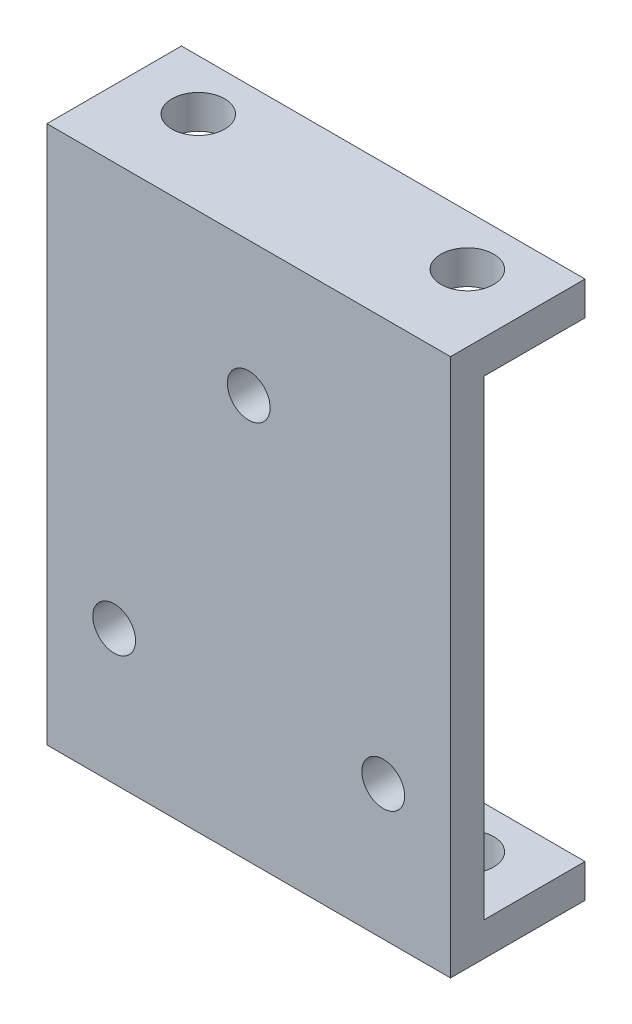
ISO-10303-21;
HEADER;
FILE_DESCRIPTION(('STEP AP214'),'2;1');
FILE_NAME('part.step','',(''),(''),'','','');
FILE_SCHEMA(('AUTOMOTIVE_DESIGN { 1 0 10303 214 1 1 1 1 }'));
ENDSEC;
DATA;
#1=APPLICATION_CONTEXT('core data for automotive mechanical design processes');
#2=APPLICATION_PROTOCOL_DEFINITION('international standard','automotive_design',2000,#1);
#3=PRODUCT_CONTEXT('',#1,'mechanical');
#4=PRODUCT('Part','Part','',(#3));
#5=PRODUCT_RELATED_PRODUCT_CATEGORY('part','',(#4));
#6=PRODUCT_DEFINITION_FORMATION('','',#4);
#7=PRODUCT_DEFINITION_CONTEXT('part definition',#1,'design');
#8=PRODUCT_DEFINITION('design','',#6,#7);
#9=PRODUCT_DEFINITION_SHAPE('','',#8);
#10=(LENGTH_UNIT() NAMED_UNIT(*) SI_UNIT(.MILLI.,.METRE.));
#11=(NAMED_UNIT(*) PLANE_ANGLE_UNIT() SI_UNIT($,.RADIAN.));
#12=(NAMED_UNIT(*) SI_UNIT($,.STERADIAN.) SOLID_ANGLE_UNIT());
#13=UNCERTAINTY_MEASURE_WITH_UNIT(LENGTH_MEASURE(1.E-05),#10,'distance_accuracy_value','');
#14=(GEOMETRIC_REPRESENTATION_CONTEXT(3) GLOBAL_UNCERTAINTY_ASSIGNED_CONTEXT((#13)) GLOBAL_UNIT_ASSIGNED_CONTEXT((#10,
#11,#12)) REPRESENTATION_CONTEXT('',''));
#15=CARTESIAN_POINT('',(0.,0.,0.));
#16=DIRECTION('',(0.,0.,1.));
#17=DIRECTION('',(1.,0.,0.));
#18=AXIS2_PLACEMENT_3D('',#15,#16,#17);
#19=CARTESIAN_POINT('',(-12.7,-25.4,-7.9375));
#20=DIRECTION('',(0.,1.,0.));
#21=DIRECTION('',(0.,0.,1.));
#22=AXIS2_PLACEMENT_3D('',#19,#20,#21);
#23=CYLINDRICAL_SURFACE('',#22,2.4892);
#24=CARTESIAN_POINT('',(-12.7,22.225,-7.9375));
#25=DIRECTION('',(0.,1.,0.));
#26=DIRECTION('',(0.,0.,1.));
#27=AXIS2_PLACEMENT_3D('',#24,#25,#26);
#28=CIRCLE('',#27,2.4892);
#29=CARTESIAN_POINT('',(-12.7,22.225,-5.4483));
#30=VERTEX_POINT('',#29);
#31=EDGE_CURVE('E20',#30,#30,#28,.F.);
#32=ORIENTED_EDGE('',*,*,#31,.T.);
#33=EDGE_LOOP('',(#32));
#34=FACE_BOUND('',#33,.T.);
#35=CARTESIAN_POINT('',(-12.7,25.4,-7.9375));
#36=DIRECTION('',(0.,1.,0.));
#37=DIRECTION('',(0.,0.,1.));
#38=AXIS2_PLACEMENT_3D('',#35,#36,#37);
#39=CIRCLE('',#38,2.4892);
#40=CARTESIAN_POINT('',(-12.7,25.4,-5.4483));
#41=VERTEX_POINT('',#40);
#42=EDGE_CURVE('E147',#41,#41,#39,.T.);
#43=ORIENTED_EDGE('',*,*,#42,.T.);
#44=EDGE_LOOP('',(#43));
#45=FACE_BOUND('',#44,.T.);
#46=ADVANCED_FACE('F17',(#34,#45),#23,.F.);
#47=CARTESIAN_POINT('',(12.7,-25.4,-7.9375));
#48=DIRECTION('',(0.,1.,0.));
#49=DIRECTION('',(0.,0.,1.));
#50=AXIS2_PLACEMENT_3D('',#47,#48,#49);
#51=CYLINDRICAL_SURFACE('',#50,2.4892);
#52=CARTESIAN_POINT('',(12.7,22.225,-7.9375));
#53=DIRECTION('',(0.,1.,0.));
#54=DIRECTION('',(0.,0.,1.));
#55=AXIS2_PLACEMENT_3D('',#52,#53,#54);
#56=CIRCLE('',#55,2.4892);
#57=CARTESIAN_POINT('',(12.7,22.225,-5.4483));
#58=VERTEX_POINT('',#57);
#59=EDGE_CURVE('E126',#58,#58,#56,.F.);
#60=ORIENTED_EDGE('',*,*,#59,.T.);
#61=EDGE_LOOP('',(#60));
#62=FACE_BOUND('',#61,.T.);
#63=CARTESIAN_POINT('',(12.7,25.4,-7.9375));
#64=DIRECTION('',(0.,1.,0.));
#65=DIRECTION('',(0.,0.,1.));
#66=AXIS2_PLACEMENT_3D('',#63,#64,#65);
#67=CIRCLE('',#66,2.4892);
#68=CARTESIAN_POINT('',(12.7,25.4,-5.4483));
#69=VERTEX_POINT('',#68);
#70=EDGE_CURVE('E96',#69,#69,#67,.T.);
#71=ORIENTED_EDGE('',*,*,#70,.T.);
#72=EDGE_LOOP('',(#71));
#73=FACE_BOUND('',#72,.T.);
#74=ADVANCED_FACE('F234',(#62,#73),#51,.F.);
#75=CARTESIAN_POINT('',(-12.7,-25.4,-7.9375));
#76=DIRECTION('',(0.,1.,0.));
#77=DIRECTION('',(0.,0.,1.));
#78=AXIS2_PLACEMENT_3D('',#75,#76,#77);
#79=CYLINDRICAL_SURFACE('',#78,2.4892);
#80=CARTESIAN_POINT('',(-12.7,-25.4,-7.9375));
#81=DIRECTION('',(0.,1.,0.));
#82=DIRECTION('',(0.,0.,1.));
#83=AXIS2_PLACEMENT_3D('',#80,#81,#82);
#84=CIRCLE('',#83,2.4892);
#85=CARTESIAN_POINT('',(-12.7,-25.4,-5.4483));
#86=VERTEX_POINT('',#85);
#87=EDGE_CURVE('E141',#86,#86,#84,.F.);
#88=ORIENTED_EDGE('',*,*,#87,.T.);
#89=EDGE_LOOP('',(#88));
#90=FACE_BOUND('',#89,.T.);
#91=CARTESIAN_POINT('',(-12.7,-22.225,-7.9375));
#92=DIRECTION('',(0.,1.,0.));
#93=DIRECTION('',(0.,0.,1.));
#94=AXIS2_PLACEMENT_3D('',#91,#92,#93);
#95=CIRCLE('',#94,2.4892);
#96=CARTESIAN_POINT('',(-12.7,-22.225,-5.4483));
#97=VERTEX_POINT('',#96);
#98=EDGE_CURVE('E124',#97,#97,#95,.T.);
#99=ORIENTED_EDGE('',*,*,#98,.T.);
#100=EDGE_LOOP('',(#99));
#101=FACE_BOUND('',#100,.T.);
#102=ADVANCED_FACE('F232',(#90,#101),#79,.F.);
#103=CARTESIAN_POINT('',(12.7,-25.4,-7.9375));
#104=DIRECTION('',(0.,1.,0.));
#105=DIRECTION('',(0.,0.,1.));
#106=AXIS2_PLACEMENT_3D('',#103,#104,#105);
#107=CYLINDRICAL_SURFACE('',#106,2.4892);
#108=CARTESIAN_POINT('',(12.7,-25.4,-7.9375));
#109=DIRECTION('',(0.,1.,0.));
#110=DIRECTION('',(0.,0.,1.));
#111=AXIS2_PLACEMENT_3D('',#108,#109,#110);
#112=CIRCLE('',#111,2.4892);
#113=CARTESIAN_POINT('',(12.7,-25.4,-5.4483));
#114=VERTEX_POINT('',#113);
#115=EDGE_CURVE('E137',#114,#114,#112,.F.);
#116=ORIENTED_EDGE('',*,*,#115,.T.);
#117=EDGE_LOOP('',(#116));
#118=FACE_BOUND('',#117,.T.);
#119=CARTESIAN_POINT('',(12.7,-22.225,-7.9375));
#120=DIRECTION('',(0.,1.,0.));
#121=DIRECTION('',(0.,0.,1.));
#122=AXIS2_PLACEMENT_3D('',#119,#120,#121);
#123=CIRCLE('',#122,2.4892);
#124=CARTESIAN_POINT('',(12.7,-22.225,-5.4483));
#125=VERTEX_POINT('',#124);
#126=EDGE_CURVE('E120',#125,#125,#123,.T.);
#127=ORIENTED_EDGE('',*,*,#126,.T.);
#128=EDGE_LOOP('',(#127));
#129=FACE_BOUND('',#128,.T.);
#130=ADVANCED_FACE('F181',(#118,#129),#107,.F.);
#131=CARTESIAN_POINT('',(19.05,25.4,-12.7));
#132=DIRECTION('',(0.,0.,1.));
#133=DIRECTION('',(1.,0.,0.));
#134=AXIS2_PLACEMENT_3D('',#131,#132,#133);
#135=PLANE('',#134);
#136=DIRECTION('',(1.,0.,0.));
#137=VECTOR('',#136,1.);
#138=CARTESIAN_POINT('',(19.05,25.4,-12.7));
#139=LINE('',#138,#137);
#140=CARTESIAN_POINT('',(-19.05,25.4,-12.7));
#141=VERTEX_POINT('',#140);
#142=CARTESIAN_POINT('',(19.05,25.4,-12.7));
#143=VERTEX_POINT('',#142);
#144=EDGE_CURVE('E86',#141,#143,#139,.T.);
#145=ORIENTED_EDGE('',*,*,#144,.T.);
#146=DIRECTION('',(0.,1.,0.));
#147=VECTOR('',#146,1.);
#148=CARTESIAN_POINT('',(19.05,-25.4,-12.7));
#149=LINE('',#148,#147);
#150=CARTESIAN_POINT('',(19.05,22.225,-12.7));
#151=VERTEX_POINT('',#150);
#152=EDGE_CURVE('E89',#143,#151,#149,.F.);
#153=ORIENTED_EDGE('',*,*,#152,.T.);
#154=DIRECTION('',(1.,0.,0.));
#155=VECTOR('',#154,1.);
#156=CARTESIAN_POINT('',(19.05,22.225,-12.7));
#157=LINE('',#156,#155);
#158=CARTESIAN_POINT('',(-19.05,22.225,-12.7));
#159=VERTEX_POINT('',#158);
#160=EDGE_CURVE('E80',#151,#159,#157,.F.);
#161=ORIENTED_EDGE('',*,*,#160,.T.);
#162=DIRECTION('',(0.,1.,0.));
#163=VECTOR('',#162,1.);
#164=CARTESIAN_POINT('',(-19.05,-25.4,-12.7));
#165=LINE('',#164,#163);
#166=EDGE_CURVE('E90',#141,#159,#165,.F.);
#167=ORIENTED_EDGE('',*,*,#166,.F.);
#168=EDGE_LOOP('',(#145,#153,#161,#167));
#169=FACE_BOUND('',#168,.T.);
#170=ADVANCED_FACE('F88',(#169),#135,.F.);
#171=CARTESIAN_POINT('',(19.05,22.225,-12.7));
#172=DIRECTION('',(0.,1.,0.));
#173=DIRECTION('',(0.,0.,1.));
#174=AXIS2_PLACEMENT_3D('',#171,#172,#173);
#175=PLANE('',#174);
#176=ORIENTED_EDGE('',*,*,#160,.F.);
#177=DIRECTION('',(0.,0.,1.));
#178=VECTOR('',#177,1.);
#179=CARTESIAN_POINT('',(19.05,22.225,0.));
#180=LINE('',#179,#178);
#181=CARTESIAN_POINT('',(19.05,22.225,-3.175));
#182=VERTEX_POINT('',#181);
#183=EDGE_CURVE('E104',#151,#182,#180,.T.);
#184=ORIENTED_EDGE('',*,*,#183,.T.);
#185=DIRECTION('',(1.,0.,0.));
#186=VECTOR('',#185,1.);
#187=CARTESIAN_POINT('',(19.05,22.225,-3.175));
#188=LINE('',#187,#186);
#189=CARTESIAN_POINT('',(-19.05,22.225,-3.175));
#190=VERTEX_POINT('',#189);
#191=EDGE_CURVE('E121',#182,#190,#188,.F.);
#192=ORIENTED_EDGE('',*,*,#191,.T.);
#193=DIRECTION('',(0.,0.,1.));
#194=VECTOR('',#193,1.);
#195=CARTESIAN_POINT('',(-19.05,22.225,0.));
#196=LINE('',#195,#194);
#197=EDGE_CURVE('E377',#159,#190,#196,.T.);
#198=ORIENTED_EDGE('',*,*,#197,.F.);
#199=EDGE_LOOP('',(#176,#184,#192,#198));
#200=FACE_BOUND('',#199,.T.);
#201=ORIENTED_EDGE('',*,*,#59,.F.);
#202=EDGE_LOOP('',(#201));
#203=FACE_BOUND('',#202,.T.);
#204=ORIENTED_EDGE('',*,*,#31,.F.);
#205=EDGE_LOOP('',(#204));
#206=FACE_BOUND('',#205,.T.);
#207=ADVANCED_FACE('F169',(#200,#203,#206),#175,.F.);
#208=CARTESIAN_POINT('',(19.05,22.225,-3.175));
#209=DIRECTION('',(0.,0.,1.));
#210=DIRECTION('',(1.,0.,0.));
#211=AXIS2_PLACEMENT_3D('',#208,#209,#210);
#212=PLANE('',#211);
#213=ORIENTED_EDGE('',*,*,#191,.F.);
#214=DIRECTION('',(0.,1.,0.));
#215=VECTOR('',#214,1.);
#216=CARTESIAN_POINT('',(19.05,-25.4,-3.175));
#217=LINE('',#216,#215);
#218=CARTESIAN_POINT('',(19.05,-22.225,-3.175));
#219=VERTEX_POINT('',#218);
#220=EDGE_CURVE('E363',#182,#219,#217,.F.);
#221=ORIENTED_EDGE('',*,*,#220,.T.);
#222=DIRECTION('',(1.,0.,0.));
#223=VECTOR('',#222,1.);
#224=CARTESIAN_POINT('',(19.05,-22.225,-3.175));
#225=LINE('',#224,#223);
#226=CARTESIAN_POINT('',(-19.05,-22.225,-3.175));
#227=VERTEX_POINT('',#226);
#228=EDGE_CURVE('E117',#219,#227,#225,.F.);
#229=ORIENTED_EDGE('',*,*,#228,.T.);
#230=DIRECTION('',(0.,1.,0.));
#231=VECTOR('',#230,1.);
#232=CARTESIAN_POINT('',(-19.05,-25.4,-3.175));
#233=LINE('',#232,#231);
#234=EDGE_CURVE('E379',#190,#227,#233,.F.);
#235=ORIENTED_EDGE('',*,*,#234,.F.);
#236=EDGE_LOOP('',(#213,#221,#229,#235));
#237=FACE_BOUND('',#236,.T.);
#238=CARTESIAN_POINT('',(12.7,-12.7,-3.175));
#239=DIRECTION('',(0.,0.,1.));
#240=DIRECTION('',(1.,0.,0.));
#241=AXIS2_PLACEMENT_3D('',#238,#239,#240);
#242=CIRCLE('',#241,2.0193);
#243=CARTESIAN_POINT('',(14.7193,-12.7,-3.175));
#244=VERTEX_POINT('',#243);
#245=EDGE_CURVE('E150',#244,#244,#242,.T.);
#246=ORIENTED_EDGE('',*,*,#245,.T.);
#247=EDGE_LOOP('',(#246));
#248=FACE_BOUND('',#247,.T.);
#249=CARTESIAN_POINT('',(-12.7,-12.7,-3.175));
#250=DIRECTION('',(0.,0.,1.));
#251=DIRECTION('',(1.,0.,0.));
#252=AXIS2_PLACEMENT_3D('',#249,#250,#251);
#253=CIRCLE('',#252,2.0193);
#254=CARTESIAN_POINT('',(-10.6807,-12.7,-3.175));
#255=VERTEX_POINT('',#254);
#256=EDGE_CURVE('E153',#255,#255,#253,.T.);
#257=ORIENTED_EDGE('',*,*,#256,.T.);
#258=EDGE_LOOP('',(#257));
#259=FACE_BOUND('',#258,.T.);
#260=CARTESIAN_POINT('',(0.,12.7,-3.175));
#261=DIRECTION('',(0.,0.,1.));
#262=DIRECTION('',(1.,0.,0.));
#263=AXIS2_PLACEMENT_3D('',#260,#261,#262);
#264=CIRCLE('',#263,2.0193);
#265=CARTESIAN_POINT('',(2.0193,12.7,-3.175));
#266=VERTEX_POINT('',#265);
#267=EDGE_CURVE('E116',#266,#266,#264,.T.);
#268=ORIENTED_EDGE('',*,*,#267,.T.);
#269=EDGE_LOOP('',(#268));
#270=FACE_BOUND('',#269,.T.);
#271=ADVANCED_FACE('F171',(#237,#248,#259,#270),#212,.F.);
#272=CARTESIAN_POINT('',(19.05,-22.225,-3.175));
#273=DIRECTION('',(0.,-1.,0.));
#274=DIRECTION('',(0.,0.,-1.));
#275=AXIS2_PLACEMENT_3D('',#272,#273,#274);
#276=PLANE('',#275);
#277=ORIENTED_EDGE('',*,*,#228,.F.);
#278=DIRECTION('',(0.,0.,1.));
#279=VECTOR('',#278,1.);
#280=CARTESIAN_POINT('',(19.05,-22.225,0.));
#281=LINE('',#280,#279);
#282=CARTESIAN_POINT('',(19.05,-22.225,-12.7));
#283=VERTEX_POINT('',#282);
#284=EDGE_CURVE('E359',#219,#283,#281,.F.);
#285=ORIENTED_EDGE('',*,*,#284,.T.);
#286=DIRECTION('',(1.,0.,0.));
#287=VECTOR('',#286,1.);
#288=CARTESIAN_POINT('',(19.05,-22.225,-12.7));
#289=LINE('',#288,#287);
#290=CARTESIAN_POINT('',(-19.05,-22.225,-12.7));
#291=VERTEX_POINT('',#290);
#292=EDGE_CURVE('E113',#283,#291,#289,.F.);
#293=ORIENTED_EDGE('',*,*,#292,.T.);
#294=DIRECTION('',(0.,0.,1.));
#295=VECTOR('',#294,1.);
#296=CARTESIAN_POINT('',(-19.05,-22.225,0.));
#297=LINE('',#296,#295);
#298=EDGE_CURVE('E360',#227,#291,#297,.F.);
#299=ORIENTED_EDGE('',*,*,#298,.F.);
#300=EDGE_LOOP('',(#277,#285,#293,#299));
#301=FACE_BOUND('',#300,.T.);
#302=ORIENTED_EDGE('',*,*,#126,.F.);
#303=EDGE_LOOP('',(#302));
#304=FACE_BOUND('',#303,.T.);
#305=ORIENTED_EDGE('',*,*,#98,.F.);
#306=EDGE_LOOP('',(#305));
#307=FACE_BOUND('',#306,.T.);
#308=ADVANCED_FACE('F178',(#301,#304,#307),#276,.F.);
#309=CARTESIAN_POINT('',(19.05,-22.225,-12.7));
#310=DIRECTION('',(0.,0.,1.));
#311=DIRECTION('',(1.,0.,0.));
#312=AXIS2_PLACEMENT_3D('',#309,#310,#311);
#313=PLANE('',#312);
#314=ORIENTED_EDGE('',*,*,#292,.F.);
#315=DIRECTION('',(0.,1.,0.));
#316=VECTOR('',#315,1.);
#317=CARTESIAN_POINT('',(19.05,-25.4,-12.7));
#318=LINE('',#317,#316);
#319=CARTESIAN_POINT('',(19.05,-25.4,-12.7));
#320=VERTEX_POINT('',#319);
#321=EDGE_CURVE('E144',#283,#320,#318,.F.);
#322=ORIENTED_EDGE('',*,*,#321,.T.);
#323=DIRECTION('',(1.,0.,0.));
#324=VECTOR('',#323,1.);
#325=CARTESIAN_POINT('',(19.05,-25.4,-12.7));
#326=LINE('',#325,#324);
#327=CARTESIAN_POINT('',(-19.05,-25.4,-12.7));
#328=VERTEX_POINT('',#327);
#329=EDGE_CURVE('E371',#320,#328,#326,.F.);
#330=ORIENTED_EDGE('',*,*,#329,.T.);
#331=DIRECTION('',(0.,1.,0.));
#332=VECTOR('',#331,1.);
#333=CARTESIAN_POINT('',(-19.05,-25.4,-12.7));
#334=LINE('',#333,#332);
#335=EDGE_CURVE('E136',#291,#328,#334,.F.);
#336=ORIENTED_EDGE('',*,*,#335,.F.);
#337=EDGE_LOOP('',(#314,#322,#330,#336));
#338=FACE_BOUND('',#337,.T.);
#339=ADVANCED_FACE('F215',(#338),#313,.F.);
#340=CARTESIAN_POINT('',(0.,12.7,-12.7));
#341=DIRECTION('',(0.,0.,1.));
#342=DIRECTION('',(1.,0.,0.));
#343=AXIS2_PLACEMENT_3D('',#340,#341,#342);
#344=CYLINDRICAL_SURFACE('',#343,2.0193);
#345=ORIENTED_EDGE('',*,*,#267,.F.);
#346=EDGE_LOOP('',(#345));
#347=FACE_BOUND('',#346,.T.);
#348=CARTESIAN_POINT('',(0.,12.7,0.));
#349=DIRECTION('',(0.,0.,1.));
#350=DIRECTION('',(1.,0.,0.));
#351=AXIS2_PLACEMENT_3D('',#348,#349,#350);
#352=CIRCLE('',#351,2.0193);
#353=CARTESIAN_POINT('',(2.0193,12.7,0.));
#354=VERTEX_POINT('',#353);
#355=EDGE_CURVE('E133',#354,#354,#352,.T.);
#356=ORIENTED_EDGE('',*,*,#355,.T.);
#357=EDGE_LOOP('',(#356));
#358=FACE_BOUND('',#357,.T.);
#359=ADVANCED_FACE('F211',(#347,#358),#344,.F.);
#360=CARTESIAN_POINT('',(-12.7,-12.7,-12.7));
#361=DIRECTION('',(0.,0.,1.));
#362=DIRECTION('',(1.,0.,0.));
#363=AXIS2_PLACEMENT_3D('',#360,#361,#362);
#364=CYLINDRICAL_SURFACE('',#363,2.0193);
#365=ORIENTED_EDGE('',*,*,#256,.F.);
#366=EDGE_LOOP('',(#365));
#367=FACE_BOUND('',#366,.T.);
#368=CARTESIAN_POINT('',(-12.7,-12.7,0.));
#369=DIRECTION('',(0.,0.,1.));
#370=DIRECTION('',(1.,0.,0.));
#371=AXIS2_PLACEMENT_3D('',#368,#369,#370);
#372=CIRCLE('',#371,2.0193);
#373=CARTESIAN_POINT('',(-10.6807,-12.7,0.));
#374=VERTEX_POINT('',#373);
#375=EDGE_CURVE('E130',#374,#374,#372,.T.);
#376=ORIENTED_EDGE('',*,*,#375,.T.);
#377=EDGE_LOOP('',(#376));
#378=FACE_BOUND('',#377,.T.);
#379=ADVANCED_FACE('F207',(#367,#378),#364,.F.);
#380=CARTESIAN_POINT('',(12.7,-12.7,-12.7));
#381=DIRECTION('',(0.,0.,1.));
#382=DIRECTION('',(1.,0.,0.));
#383=AXIS2_PLACEMENT_3D('',#380,#381,#382);
#384=CYLINDRICAL_SURFACE('',#383,2.0193);
#385=ORIENTED_EDGE('',*,*,#245,.F.);
#386=EDGE_LOOP('',(#385));
#387=FACE_BOUND('',#386,.T.);
#388=CARTESIAN_POINT('',(12.7,-12.7,0.));
#389=DIRECTION('',(0.,0.,1.));
#390=DIRECTION('',(1.,0.,0.));
#391=AXIS2_PLACEMENT_3D('',#388,#389,#390);
#392=CIRCLE('',#391,2.0193);
#393=CARTESIAN_POINT('',(14.7193,-12.7,0.));
#394=VERTEX_POINT('',#393);
#395=EDGE_CURVE('E127',#394,#394,#392,.T.);
#396=ORIENTED_EDGE('',*,*,#395,.T.);
#397=EDGE_LOOP('',(#396));
#398=FACE_BOUND('',#397,.T.);
#399=ADVANCED_FACE('F204',(#387,#398),#384,.F.);
#400=CARTESIAN_POINT('',(19.05,25.4,0.));
#401=DIRECTION('',(0.,-1.,0.));
#402=DIRECTION('',(0.,0.,-1.));
#403=AXIS2_PLACEMENT_3D('',#400,#401,#402);
#404=PLANE('',#403);
#405=DIRECTION('',(-1.,0.,0.));
#406=VECTOR('',#405,1.);
#407=CARTESIAN_POINT('',(19.05,25.4,0.));
#408=LINE('',#407,#406);
#409=CARTESIAN_POINT('',(-19.05,25.4,0.));
#410=VERTEX_POINT('',#409);
#411=CARTESIAN_POINT('',(19.05,25.4,0.));
#412=VERTEX_POINT('',#411);
#413=EDGE_CURVE('E109',#410,#412,#408,.F.);
#414=ORIENTED_EDGE('',*,*,#413,.T.);
#415=DIRECTION('',(0.,0.,1.));
#416=VECTOR('',#415,1.);
#417=CARTESIAN_POINT('',(19.05,25.4,0.));
#418=LINE('',#417,#416);
#419=EDGE_CURVE('E95',#412,#143,#418,.F.);
#420=ORIENTED_EDGE('',*,*,#419,.T.);
#421=ORIENTED_EDGE('',*,*,#144,.F.);
#422=DIRECTION('',(0.,0.,1.));
#423=VECTOR('',#422,1.);
#424=CARTESIAN_POINT('',(-19.05,25.4,0.));
#425=LINE('',#424,#423);
#426=EDGE_CURVE('E374',#410,#141,#425,.F.);
#427=ORIENTED_EDGE('',*,*,#426,.F.);
#428=EDGE_LOOP('',(#414,#420,#421,#427));
#429=FACE_BOUND('',#428,.T.);
#430=ORIENTED_EDGE('',*,*,#70,.F.);
#431=EDGE_LOOP('',(#430));
#432=FACE_BOUND('',#431,.T.);
#433=ORIENTED_EDGE('',*,*,#42,.F.);
#434=EDGE_LOOP('',(#433));
#435=FACE_BOUND('',#434,.T.);
#436=ADVANCED_FACE('F107',(#429,#432,#435),#404,.F.);
#437=CARTESIAN_POINT('',(19.05,-25.4,0.));
#438=DIRECTION('',(-1.,0.,0.));
#439=DIRECTION('',(0.,0.,1.));
#440=AXIS2_PLACEMENT_3D('',#437,#438,#439);
#441=PLANE('',#440);
#442=ORIENTED_EDGE('',*,*,#321,.F.);
#443=ORIENTED_EDGE('',*,*,#284,.F.);
#444=ORIENTED_EDGE('',*,*,#220,.F.);
#445=ORIENTED_EDGE('',*,*,#183,.F.);
#446=ORIENTED_EDGE('',*,*,#152,.F.);
#447=ORIENTED_EDGE('',*,*,#419,.F.);
#448=DIRECTION('',(0.,1.,0.));
#449=VECTOR('',#448,1.);
#450=CARTESIAN_POINT('',(19.05,-25.4,0.));
#451=LINE('',#450,#449);
#452=CARTESIAN_POINT('',(19.05,-25.4,0.));
#453=VERTEX_POINT('',#452);
#454=EDGE_CURVE('E384',#412,#453,#451,.F.);
#455=ORIENTED_EDGE('',*,*,#454,.T.);
#456=DIRECTION('',(0.,0.,1.));
#457=VECTOR('',#456,1.);
#458=CARTESIAN_POINT('',(19.05,-25.4,-12.7));
#459=LINE('',#458,#457);
#460=EDGE_CURVE('E140',#453,#320,#459,.F.);
#461=ORIENTED_EDGE('',*,*,#460,.T.);
#462=EDGE_LOOP('',(#442,#443,#444,#445,#446,#447,#455,#461));
#463=FACE_BOUND('',#462,.T.);
#464=ADVANCED_FACE('F100',(#463),#441,.F.);
#465=CARTESIAN_POINT('',(19.05,-25.4,-12.7));
#466=DIRECTION('',(0.,1.,0.));
#467=DIRECTION('',(0.,0.,1.));
#468=AXIS2_PLACEMENT_3D('',#465,#466,#467);
#469=PLANE('',#468);
#470=ORIENTED_EDGE('',*,*,#329,.F.);
#471=ORIENTED_EDGE('',*,*,#460,.F.);
#472=DIRECTION('',(-1.,0.,0.));
#473=VECTOR('',#472,1.);
#474=CARTESIAN_POINT('',(19.05,-25.4,0.));
#475=LINE('',#474,#473);
#476=CARTESIAN_POINT('',(-19.05,-25.4,0.));
#477=VERTEX_POINT('',#476);
#478=EDGE_CURVE('E26',#453,#477,#475,.T.);
#479=ORIENTED_EDGE('',*,*,#478,.T.);
#480=DIRECTION('',(0.,0.,1.));
#481=VECTOR('',#480,1.);
#482=CARTESIAN_POINT('',(-19.05,-25.4,0.));
#483=LINE('',#482,#481);
#484=EDGE_CURVE('E34',#328,#477,#483,.T.);
#485=ORIENTED_EDGE('',*,*,#484,.F.);
#486=EDGE_LOOP('',(#470,#471,#479,#485));
#487=FACE_BOUND('',#486,.T.);
#488=ORIENTED_EDGE('',*,*,#115,.F.);
#489=EDGE_LOOP('',(#488));
#490=FACE_BOUND('',#489,.T.);
#491=ORIENTED_EDGE('',*,*,#87,.F.);
#492=EDGE_LOOP('',(#491));
#493=FACE_BOUND('',#492,.T.);
#494=ADVANCED_FACE('F192',(#487,#490,#493),#469,.F.);
#495=CARTESIAN_POINT('',(-19.05,-25.4,0.));
#496=DIRECTION('',(-1.,0.,0.));
#497=DIRECTION('',(0.,0.,1.));
#498=AXIS2_PLACEMENT_3D('',#495,#496,#497);
#499=PLANE('',#498);
#500=ORIENTED_EDGE('',*,*,#298,.T.);
#501=ORIENTED_EDGE('',*,*,#335,.T.);
#502=ORIENTED_EDGE('',*,*,#484,.T.);
#503=DIRECTION('',(0.,1.,0.));
#504=VECTOR('',#503,1.);
#505=CARTESIAN_POINT('',(-19.05,-25.4,0.));
#506=LINE('',#505,#504);
#507=EDGE_CURVE('E11',#477,#410,#506,.T.);
#508=ORIENTED_EDGE('',*,*,#507,.T.);
#509=ORIENTED_EDGE('',*,*,#426,.T.);
#510=ORIENTED_EDGE('',*,*,#166,.T.);
#511=ORIENTED_EDGE('',*,*,#197,.T.);
#512=ORIENTED_EDGE('',*,*,#234,.T.);
#513=EDGE_LOOP('',(#500,#501,#502,#508,#509,#510,#511,#512));
#514=FACE_BOUND('',#513,.T.);
#515=ADVANCED_FACE('F186',(#514),#499,.T.);
#516=CARTESIAN_POINT('',(19.05,-25.4,0.));
#517=DIRECTION('',(0.,0.,-1.));
#518=DIRECTION('',(-1.,0.,0.));
#519=AXIS2_PLACEMENT_3D('',#516,#517,#518);
#520=PLANE('',#519);
#521=ORIENTED_EDGE('',*,*,#478,.F.);
#522=ORIENTED_EDGE('',*,*,#454,.F.);
#523=ORIENTED_EDGE('',*,*,#413,.F.);
#524=ORIENTED_EDGE('',*,*,#507,.F.);
#525=EDGE_LOOP('',(#521,#522,#523,#524));
#526=FACE_BOUND('',#525,.T.);
#527=ORIENTED_EDGE('',*,*,#395,.F.);
#528=EDGE_LOOP('',(#527));
#529=FACE_BOUND('',#528,.T.);
#530=ORIENTED_EDGE('',*,*,#375,.F.);
#531=EDGE_LOOP('',(#530));
#532=FACE_BOUND('',#531,.T.);
#533=ORIENTED_EDGE('',*,*,#355,.F.);
#534=EDGE_LOOP('',(#533));
#535=FACE_BOUND('',#534,.T.);
#536=ADVANCED_FACE('F184',(#526,#529,#532,#535),#520,.F.);
#537=CLOSED_SHELL('',(#46,#74,#102,#130,#170,#207,#271,#308,#339,#359,#379,#399,#436,#464,#494,
#515,#536));
#538=MANIFOLD_SOLID_BREP('B1',#537);
#539=ADVANCED_BREP_SHAPE_REPRESENTATION('',(#18,#538),#14);
#540=SHAPE_DEFINITION_REPRESENTATION(#9,#539);
ENDSEC;
END-ISO-10303-21;
